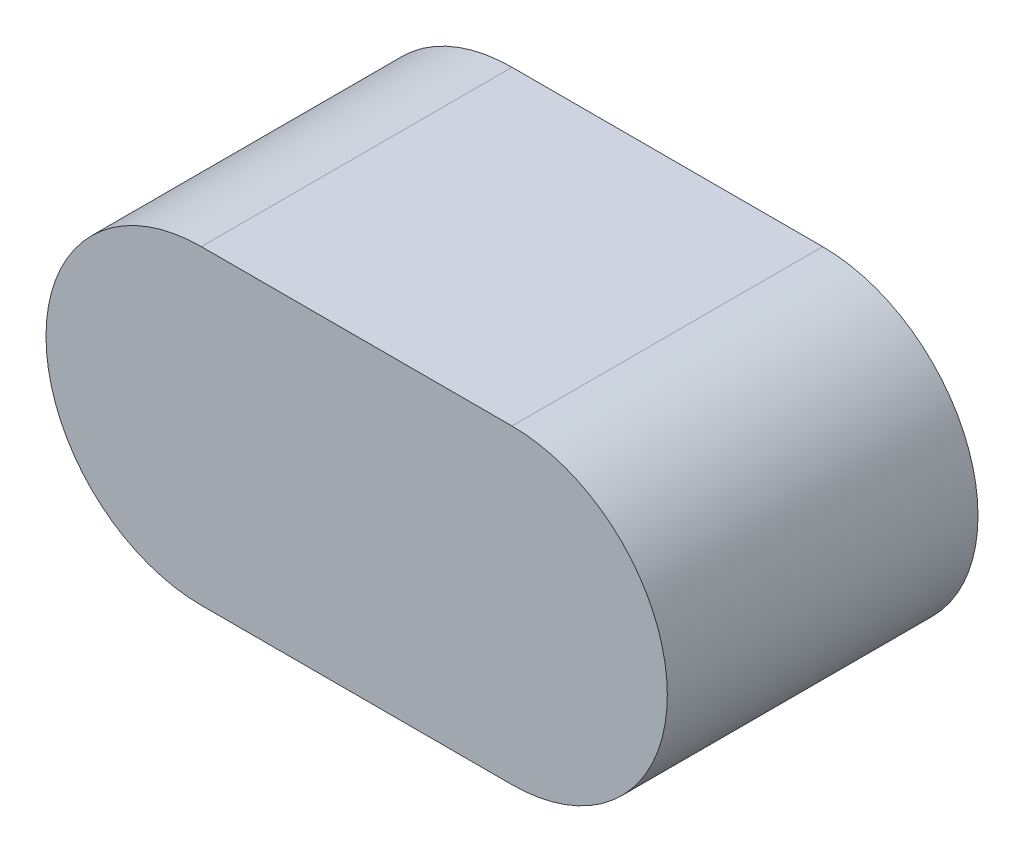
ISO-10303-21;
HEADER;
FILE_DESCRIPTION(('STEP AP214'),'2;1');
FILE_NAME('part.step','',(''),(''),'','','');
FILE_SCHEMA(('AUTOMOTIVE_DESIGN { 1 0 10303 214 1 1 1 1 }'));
ENDSEC;
DATA;
#1=APPLICATION_CONTEXT('core data for automotive mechanical design processes');
#2=APPLICATION_PROTOCOL_DEFINITION('international standard','automotive_design',2000,#1);
#3=PRODUCT_CONTEXT('',#1,'mechanical');
#4=PRODUCT('Part','Part','',(#3));
#5=PRODUCT_RELATED_PRODUCT_CATEGORY('part','',(#4));
#6=PRODUCT_DEFINITION_FORMATION('','',#4);
#7=PRODUCT_DEFINITION_CONTEXT('part definition',#1,'design');
#8=PRODUCT_DEFINITION('design','',#6,#7);
#9=PRODUCT_DEFINITION_SHAPE('','',#8);
#10=(LENGTH_UNIT() NAMED_UNIT(*) SI_UNIT(.MILLI.,.METRE.));
#11=(NAMED_UNIT(*) PLANE_ANGLE_UNIT() SI_UNIT($,.RADIAN.));
#12=(NAMED_UNIT(*) SI_UNIT($,.STERADIAN.) SOLID_ANGLE_UNIT());
#13=UNCERTAINTY_MEASURE_WITH_UNIT(LENGTH_MEASURE(1.E-05),#10,'distance_accuracy_value','');
#14=(GEOMETRIC_REPRESENTATION_CONTEXT(3) GLOBAL_UNCERTAINTY_ASSIGNED_CONTEXT((#13)) GLOBAL_UNIT_ASSIGNED_CONTEXT((#10,
#11,#12)) REPRESENTATION_CONTEXT('',''));
#15=CARTESIAN_POINT('',(0.,0.,0.));
#16=DIRECTION('',(0.,0.,1.));
#17=DIRECTION('',(1.,0.,0.));
#18=AXIS2_PLACEMENT_3D('',#15,#16,#17);
#19=CARTESIAN_POINT('',(-4.14285714285714,2.19047619047619,3.));
#20=DIRECTION('',(0.,0.,-1.));
#21=DIRECTION('',(-1.,0.,0.));
#22=AXIS2_PLACEMENT_3D('',#19,#20,#21);
#23=CYLINDRICAL_SURFACE('',#22,1.5);
#24=CARTESIAN_POINT('',(-4.14285714285714,2.19047619047619,0.));
#25=DIRECTION('',(0.,0.,1.));
#26=DIRECTION('',(1.,0.,0.));
#27=AXIS2_PLACEMENT_3D('',#24,#25,#26);
#28=CIRCLE('',#27,1.5);
#29=CARTESIAN_POINT('',(-4.14285714285714,3.69047619047619,0.));
#30=VERTEX_POINT('',#29);
#31=CARTESIAN_POINT('',(-4.14285714285714,0.690476190476194,0.));
#32=VERTEX_POINT('',#31);
#33=EDGE_CURVE('E102',#30,#32,#28,.T.);
#34=ORIENTED_EDGE('',*,*,#33,.T.);
#35=DIRECTION('',(0.,0.,-1.));
#36=VECTOR('',#35,1.);
#37=CARTESIAN_POINT('',(-4.14285714285714,0.690476190476194,3.));
#38=LINE('',#37,#36);
#39=CARTESIAN_POINT('',(-4.14285714285714,0.690476190476194,3.));
#40=VERTEX_POINT('',#39);
#41=EDGE_CURVE('E11',#40,#32,#38,.T.);
#42=ORIENTED_EDGE('',*,*,#41,.F.);
#43=CARTESIAN_POINT('',(-4.14285714285714,2.19047619047619,3.));
#44=DIRECTION('',(0.,0.,1.));
#45=DIRECTION('',(1.,0.,0.));
#46=AXIS2_PLACEMENT_3D('',#43,#44,#45);
#47=CIRCLE('',#46,1.5);
#48=CARTESIAN_POINT('',(-4.14285714285714,3.69047619047619,3.));
#49=VERTEX_POINT('',#48);
#50=EDGE_CURVE('E90',#49,#40,#47,.T.);
#51=ORIENTED_EDGE('',*,*,#50,.F.);
#52=DIRECTION('',(0.,0.,-1.));
#53=VECTOR('',#52,1.);
#54=CARTESIAN_POINT('',(-4.14285714285714,3.69047619047619,3.));
#55=LINE('',#54,#53);
#56=EDGE_CURVE('E98',#49,#30,#55,.T.);
#57=ORIENTED_EDGE('',*,*,#56,.T.);
#58=EDGE_LOOP('',(#34,#42,#51,#57));
#59=FACE_BOUND('',#58,.T.);
#60=ADVANCED_FACE('F39',(#59),#23,.T.);
#61=CARTESIAN_POINT('',(-4.14285714285714,0.690476190476194,3.));
#62=DIRECTION('',(0.,1.,0.));
#63=DIRECTION('',(-1.,0.,0.));
#64=AXIS2_PLACEMENT_3D('',#61,#62,#63);
#65=PLANE('',#64);
#66=DIRECTION('',(1.,0.,0.));
#67=VECTOR('',#66,1.);
#68=CARTESIAN_POINT('',(-4.14285714285714,0.690476190476194,0.));
#69=LINE('',#68,#67);
#70=CARTESIAN_POINT('',(-1.14285714285714,0.690476190476194,0.));
#71=VERTEX_POINT('',#70);
#72=EDGE_CURVE('E94',#32,#71,#69,.T.);
#73=ORIENTED_EDGE('',*,*,#72,.T.);
#74=DIRECTION('',(0.,0.,-1.));
#75=VECTOR('',#74,1.);
#76=CARTESIAN_POINT('',(-1.14285714285714,0.690476190476194,3.));
#77=LINE('',#76,#75);
#78=CARTESIAN_POINT('',(-1.14285714285714,0.690476190476194,3.));
#79=VERTEX_POINT('',#78);
#80=EDGE_CURVE('E47',#79,#71,#77,.T.);
#81=ORIENTED_EDGE('',*,*,#80,.F.);
#82=DIRECTION('',(1.,0.,0.));
#83=VECTOR('',#82,1.);
#84=CARTESIAN_POINT('',(-4.14285714285714,0.690476190476194,3.));
#85=LINE('',#84,#83);
#86=EDGE_CURVE('E85',#40,#79,#85,.T.);
#87=ORIENTED_EDGE('',*,*,#86,.F.);
#88=ORIENTED_EDGE('',*,*,#41,.T.);
#89=EDGE_LOOP('',(#73,#81,#87,#88));
#90=FACE_BOUND('',#89,.T.);
#91=ADVANCED_FACE('F93',(#90),#65,.F.);
#92=CARTESIAN_POINT('',(-1.14285714285714,2.19047619047619,3.));
#93=DIRECTION('',(0.,0.,-1.));
#94=DIRECTION('',(-1.,0.,0.));
#95=AXIS2_PLACEMENT_3D('',#92,#93,#94);
#96=CYLINDRICAL_SURFACE('',#95,1.5);
#97=CARTESIAN_POINT('',(-1.14285714285714,2.19047619047619,0.));
#98=DIRECTION('',(0.,0.,1.));
#99=DIRECTION('',(1.,0.,0.));
#100=AXIS2_PLACEMENT_3D('',#97,#98,#99);
#101=CIRCLE('',#100,1.5);
#102=CARTESIAN_POINT('',(-1.14285714285714,3.69047619047619,0.));
#103=VERTEX_POINT('',#102);
#104=EDGE_CURVE('E72',#71,#103,#101,.T.);
#105=ORIENTED_EDGE('',*,*,#104,.T.);
#106=DIRECTION('',(0.,0.,-1.));
#107=VECTOR('',#106,1.);
#108=CARTESIAN_POINT('',(-1.14285714285714,3.69047619047619,3.));
#109=LINE('',#108,#107);
#110=CARTESIAN_POINT('',(-1.14285714285714,3.69047619047619,3.));
#111=VERTEX_POINT('',#110);
#112=EDGE_CURVE('E95',#111,#103,#109,.T.);
#113=ORIENTED_EDGE('',*,*,#112,.F.);
#114=CARTESIAN_POINT('',(-1.14285714285714,2.19047619047619,3.));
#115=DIRECTION('',(0.,0.,1.));
#116=DIRECTION('',(1.,0.,0.));
#117=AXIS2_PLACEMENT_3D('',#114,#115,#116);
#118=CIRCLE('',#117,1.5);
#119=EDGE_CURVE('E88',#79,#111,#118,.T.);
#120=ORIENTED_EDGE('',*,*,#119,.F.);
#121=ORIENTED_EDGE('',*,*,#80,.T.);
#122=EDGE_LOOP('',(#105,#113,#120,#121));
#123=FACE_BOUND('',#122,.T.);
#124=ADVANCED_FACE('F96',(#123),#96,.T.);
#125=CARTESIAN_POINT('',(-4.14285714285714,3.69047619047619,3.));
#126=DIRECTION('',(0.,-1.,0.));
#127=DIRECTION('',(0.,0.,-1.));
#128=AXIS2_PLACEMENT_3D('',#125,#126,#127);
#129=PLANE('',#128);
#130=DIRECTION('',(-1.,0.,0.));
#131=VECTOR('',#130,1.);
#132=CARTESIAN_POINT('',(-4.14285714285714,3.69047619047619,0.));
#133=LINE('',#132,#131);
#134=EDGE_CURVE('E78',#103,#30,#133,.T.);
#135=ORIENTED_EDGE('',*,*,#134,.T.);
#136=ORIENTED_EDGE('',*,*,#56,.F.);
#137=DIRECTION('',(-1.,0.,0.));
#138=VECTOR('',#137,1.);
#139=CARTESIAN_POINT('',(-4.14285714285714,3.69047619047619,3.));
#140=LINE('',#139,#138);
#141=EDGE_CURVE('E55',#111,#49,#140,.T.);
#142=ORIENTED_EDGE('',*,*,#141,.F.);
#143=ORIENTED_EDGE('',*,*,#112,.T.);
#144=EDGE_LOOP('',(#135,#136,#142,#143));
#145=FACE_BOUND('',#144,.T.);
#146=ADVANCED_FACE('F109',(#145),#129,.F.);
#147=CARTESIAN_POINT('',(-4.14285714285714,2.19047619047619,3.));
#148=DIRECTION('',(0.,0.,1.));
#149=DIRECTION('',(1.,0.,0.));
#150=AXIS2_PLACEMENT_3D('',#147,#148,#149);
#151=PLANE('',#150);
#152=ORIENTED_EDGE('',*,*,#50,.T.);
#153=ORIENTED_EDGE('',*,*,#86,.T.);
#154=ORIENTED_EDGE('',*,*,#119,.T.);
#155=ORIENTED_EDGE('',*,*,#141,.T.);
#156=EDGE_LOOP('',(#152,#153,#154,#155));
#157=FACE_BOUND('',#156,.T.);
#158=ADVANCED_FACE('F86',(#157),#151,.T.);
#159=CARTESIAN_POINT('',(-4.14285714285714,2.19047619047619,0.));
#160=DIRECTION('',(0.,0.,1.));
#161=DIRECTION('',(1.,0.,0.));
#162=AXIS2_PLACEMENT_3D('',#159,#160,#161);
#163=PLANE('',#162);
#164=ORIENTED_EDGE('',*,*,#33,.F.);
#165=ORIENTED_EDGE('',*,*,#134,.F.);
#166=ORIENTED_EDGE('',*,*,#104,.F.);
#167=ORIENTED_EDGE('',*,*,#72,.F.);
#168=EDGE_LOOP('',(#164,#165,#166,#167));
#169=FACE_BOUND('',#168,.T.);
#170=ADVANCED_FACE('F112',(#169),#163,.F.);
#171=CLOSED_SHELL('',(#60,#91,#124,#146,#158,#170));
#172=MANIFOLD_SOLID_BREP('B2',#171);
#173=ADVANCED_BREP_SHAPE_REPRESENTATION('',(#18,#172),#14);
#174=SHAPE_DEFINITION_REPRESENTATION(#9,#173);
ENDSEC;
END-ISO-10303-21;
